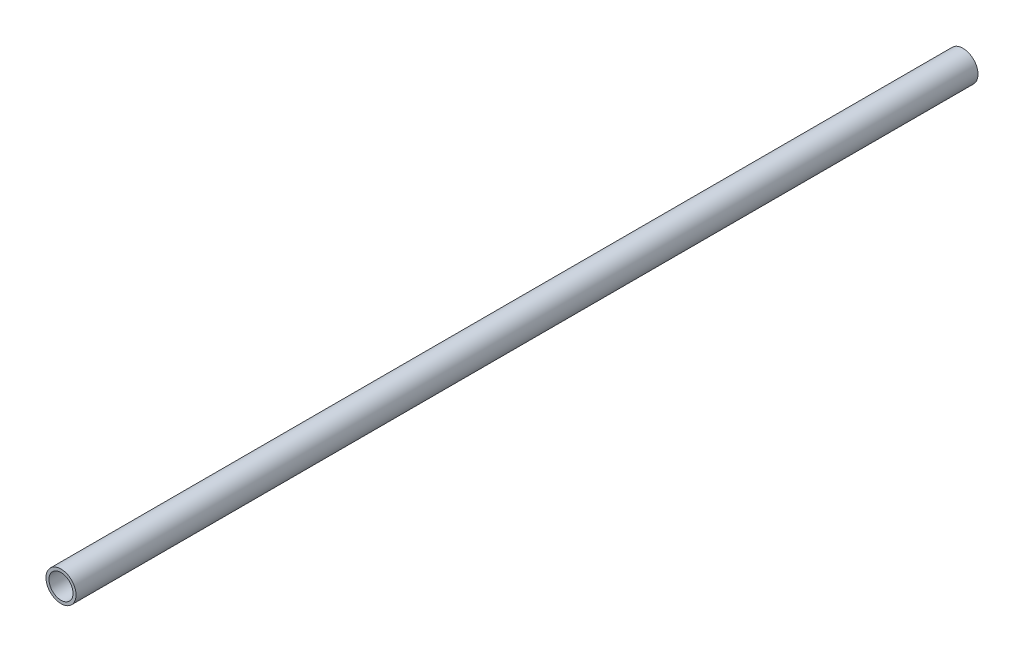
ISO-10303-21;
HEADER;
FILE_DESCRIPTION(('STEP AP214'),'2;1');
FILE_NAME('part.step','',(''),(''),'','','');
FILE_SCHEMA(('AUTOMOTIVE_DESIGN { 1 0 10303 214 1 1 1 1 }'));
ENDSEC;
DATA;
#1=APPLICATION_CONTEXT('core data for automotive mechanical design processes');
#2=APPLICATION_PROTOCOL_DEFINITION('international standard','automotive_design',2000,#1);
#3=PRODUCT_CONTEXT('',#1,'mechanical');
#4=PRODUCT('Part','Part','',(#3));
#5=PRODUCT_RELATED_PRODUCT_CATEGORY('part','',(#4));
#6=PRODUCT_DEFINITION_FORMATION('','',#4);
#7=PRODUCT_DEFINITION_CONTEXT('part definition',#1,'design');
#8=PRODUCT_DEFINITION('design','',#6,#7);
#9=PRODUCT_DEFINITION_SHAPE('','',#8);
#10=(LENGTH_UNIT() NAMED_UNIT(*) SI_UNIT(.MILLI.,.METRE.));
#11=(NAMED_UNIT(*) PLANE_ANGLE_UNIT() SI_UNIT($,.RADIAN.));
#12=(NAMED_UNIT(*) SI_UNIT($,.STERADIAN.) SOLID_ANGLE_UNIT());
#13=UNCERTAINTY_MEASURE_WITH_UNIT(LENGTH_MEASURE(1.E-05),#10,'distance_accuracy_value','');
#14=(GEOMETRIC_REPRESENTATION_CONTEXT(3) GLOBAL_UNCERTAINTY_ASSIGNED_CONTEXT((#13)) GLOBAL_UNIT_ASSIGNED_CONTEXT((#10,
#11,#12)) REPRESENTATION_CONTEXT('',''));
#15=CARTESIAN_POINT('',(0.,0.,0.));
#16=DIRECTION('',(0.,0.,1.));
#17=DIRECTION('',(1.,0.,0.));
#18=AXIS2_PLACEMENT_3D('',#15,#16,#17);
#19=CARTESIAN_POINT('',(0.,0.,300.));
#20=DIRECTION('',(0.,0.,1.));
#21=DIRECTION('',(1.,0.,0.));
#22=AXIS2_PLACEMENT_3D('',#19,#20,#21);
#23=PLANE('',#22);
#24=CARTESIAN_POINT('',(0.,0.,300.));
#25=DIRECTION('',(0.,0.,1.));
#26=DIRECTION('',(1.,0.,0.));
#27=AXIS2_PLACEMENT_3D('',#24,#25,#26);
#28=CIRCLE('',#27,5.);
#29=CARTESIAN_POINT('',(5.,0.,300.));
#30=VERTEX_POINT('',#29);
#31=EDGE_CURVE('E10',#30,#30,#28,.T.);
#32=ORIENTED_EDGE('',*,*,#31,.T.);
#33=EDGE_LOOP('',(#32));
#34=FACE_BOUND('',#33,.T.);
#35=CARTESIAN_POINT('',(0.,0.,300.));
#36=DIRECTION('',(0.,0.,1.));
#37=DIRECTION('',(1.,0.,0.));
#38=AXIS2_PLACEMENT_3D('',#35,#36,#37);
#39=CIRCLE('',#38,4.);
#40=CARTESIAN_POINT('',(4.,0.,300.));
#41=VERTEX_POINT('',#40);
#42=EDGE_CURVE('E45',#41,#41,#39,.T.);
#43=ORIENTED_EDGE('',*,*,#42,.F.);
#44=EDGE_LOOP('',(#43));
#45=FACE_BOUND('',#44,.T.);
#46=ADVANCED_FACE('F34',(#34,#45),#23,.T.);
#47=CARTESIAN_POINT('',(0.,0.,0.));
#48=DIRECTION('',(0.,0.,1.));
#49=DIRECTION('',(1.,0.,0.));
#50=AXIS2_PLACEMENT_3D('',#47,#48,#49);
#51=PLANE('',#50);
#52=CARTESIAN_POINT('',(0.,0.,0.));
#53=DIRECTION('',(0.,0.,1.));
#54=DIRECTION('',(1.,0.,0.));
#55=AXIS2_PLACEMENT_3D('',#52,#53,#54);
#56=CIRCLE('',#55,5.);
#57=CARTESIAN_POINT('',(5.,0.,0.));
#58=VERTEX_POINT('',#57);
#59=EDGE_CURVE('E38',#58,#58,#56,.T.);
#60=ORIENTED_EDGE('',*,*,#59,.F.);
#61=EDGE_LOOP('',(#60));
#62=FACE_BOUND('',#61,.T.);
#63=CARTESIAN_POINT('',(0.,0.,0.));
#64=DIRECTION('',(0.,0.,1.));
#65=DIRECTION('',(1.,0.,0.));
#66=AXIS2_PLACEMENT_3D('',#63,#64,#65);
#67=CIRCLE('',#66,4.);
#68=CARTESIAN_POINT('',(4.,0.,0.));
#69=VERTEX_POINT('',#68);
#70=EDGE_CURVE('E47',#69,#69,#67,.T.);
#71=ORIENTED_EDGE('',*,*,#70,.T.);
#72=EDGE_LOOP('',(#71));
#73=FACE_BOUND('',#72,.T.);
#74=ADVANCED_FACE('F57',(#62,#73),#51,.F.);
#75=CARTESIAN_POINT('',(0.,0.,300.));
#76=DIRECTION('',(0.,0.,-1.));
#77=DIRECTION('',(-1.,0.,0.));
#78=AXIS2_PLACEMENT_3D('',#75,#76,#77);
#79=CYLINDRICAL_SURFACE('',#78,5.);
#80=ORIENTED_EDGE('',*,*,#31,.F.);
#81=EDGE_LOOP('',(#80));
#82=FACE_BOUND('',#81,.T.);
#83=ORIENTED_EDGE('',*,*,#59,.T.);
#84=EDGE_LOOP('',(#83));
#85=FACE_BOUND('',#84,.T.);
#86=ADVANCED_FACE('F36',(#82,#85),#79,.T.);
#87=CARTESIAN_POINT('',(0.,0.,300.));
#88=DIRECTION('',(0.,0.,-1.));
#89=DIRECTION('',(-1.,0.,0.));
#90=AXIS2_PLACEMENT_3D('',#87,#88,#89);
#91=CYLINDRICAL_SURFACE('',#90,4.);
#92=ORIENTED_EDGE('',*,*,#42,.T.);
#93=EDGE_LOOP('',(#92));
#94=FACE_BOUND('',#93,.T.);
#95=ORIENTED_EDGE('',*,*,#70,.F.);
#96=EDGE_LOOP('',(#95));
#97=FACE_BOUND('',#96,.T.);
#98=ADVANCED_FACE('F53',(#94,#97),#91,.F.);
#99=CLOSED_SHELL('',(#46,#74,#86,#98));
#100=MANIFOLD_SOLID_BREP('B2',#99);
#101=ADVANCED_BREP_SHAPE_REPRESENTATION('',(#18,#100),#14);
#102=SHAPE_DEFINITION_REPRESENTATION(#9,#101);
ENDSEC;
END-ISO-10303-21;
